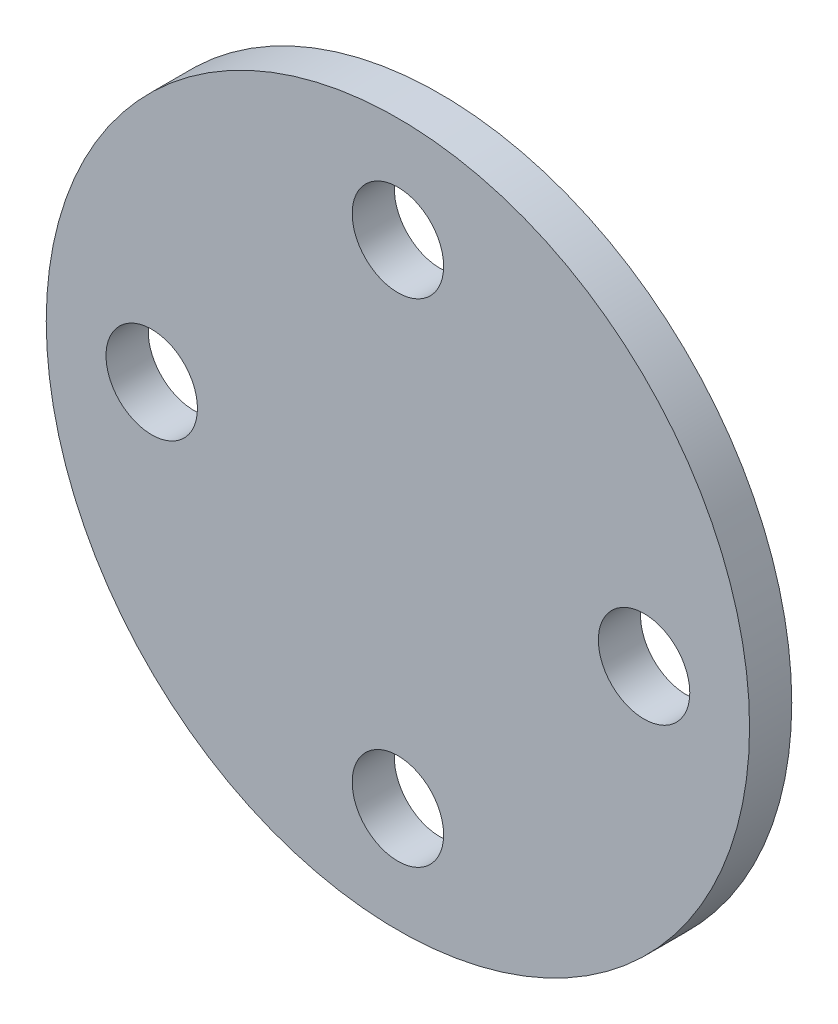
ISO-10303-21;
HEADER;
FILE_DESCRIPTION(('STEP AP214'),'2;1');
FILE_NAME('part.step','',(''),(''),'','','');
FILE_SCHEMA(('AUTOMOTIVE_DESIGN { 1 0 10303 214 1 1 1 1 }'));
ENDSEC;
DATA;
#1=APPLICATION_CONTEXT('core data for automotive mechanical design processes');
#2=APPLICATION_PROTOCOL_DEFINITION('international standard','automotive_design',2000,#1);
#3=PRODUCT_CONTEXT('',#1,'mechanical');
#4=PRODUCT('Part','Part','',(#3));
#5=PRODUCT_RELATED_PRODUCT_CATEGORY('part','',(#4));
#6=PRODUCT_DEFINITION_FORMATION('','',#4);
#7=PRODUCT_DEFINITION_CONTEXT('part definition',#1,'design');
#8=PRODUCT_DEFINITION('design','',#6,#7);
#9=PRODUCT_DEFINITION_SHAPE('','',#8);
#10=(LENGTH_UNIT() NAMED_UNIT(*) SI_UNIT(.MILLI.,.METRE.));
#11=(NAMED_UNIT(*) PLANE_ANGLE_UNIT() SI_UNIT($,.RADIAN.));
#12=(NAMED_UNIT(*) SI_UNIT($,.STERADIAN.) SOLID_ANGLE_UNIT());
#13=UNCERTAINTY_MEASURE_WITH_UNIT(LENGTH_MEASURE(1.E-05),#10,'distance_accuracy_value','');
#14=(GEOMETRIC_REPRESENTATION_CONTEXT(3) GLOBAL_UNCERTAINTY_ASSIGNED_CONTEXT((#13)) GLOBAL_UNIT_ASSIGNED_CONTEXT((#10,
#11,#12)) REPRESENTATION_CONTEXT('',''));
#15=CARTESIAN_POINT('',(0.,0.,0.));
#16=DIRECTION('',(0.,0.,1.));
#17=DIRECTION('',(1.,0.,0.));
#18=AXIS2_PLACEMENT_3D('',#15,#16,#17);
#19=CARTESIAN_POINT('',(0.,0.,3.));
#20=DIRECTION('',(0.,0.,1.));
#21=DIRECTION('',(1.,0.,0.));
#22=AXIS2_PLACEMENT_3D('',#19,#20,#21);
#23=PLANE('',#22);
#24=CARTESIAN_POINT('',(0.,-17.5,3.));
#25=DIRECTION('',(0.,0.,1.));
#26=DIRECTION('',(1.,0.,0.));
#27=AXIS2_PLACEMENT_3D('',#24,#25,#26);
#28=CIRCLE('',#27,3.25000000000012);
#29=CARTESIAN_POINT('',(3.25000000000012,-17.5,3.));
#30=VERTEX_POINT('',#29);
#31=EDGE_CURVE('E57',#30,#30,#28,.T.);
#32=ORIENTED_EDGE('',*,*,#31,.F.);
#33=EDGE_LOOP('',(#32));
#34=FACE_BOUND('',#33,.T.);
#35=CARTESIAN_POINT('',(0.,17.5,3.));
#36=DIRECTION('',(0.,0.,1.));
#37=DIRECTION('',(1.,0.,0.));
#38=AXIS2_PLACEMENT_3D('',#35,#36,#37);
#39=CIRCLE('',#38,3.25);
#40=CARTESIAN_POINT('',(3.25,17.5,3.));
#41=VERTEX_POINT('',#40);
#42=EDGE_CURVE('E46',#41,#41,#39,.T.);
#43=ORIENTED_EDGE('',*,*,#42,.F.);
#44=EDGE_LOOP('',(#43));
#45=FACE_BOUND('',#44,.T.);
#46=CARTESIAN_POINT('',(0.,0.,3.));
#47=DIRECTION('',(0.,0.,1.));
#48=DIRECTION('',(1.,0.,0.));
#49=AXIS2_PLACEMENT_3D('',#46,#47,#48);
#50=CIRCLE('',#49,25.);
#51=CARTESIAN_POINT('',(25.,0.,3.));
#52=VERTEX_POINT('',#51);
#53=EDGE_CURVE('E10',#52,#52,#50,.T.);
#54=ORIENTED_EDGE('',*,*,#53,.T.);
#55=EDGE_LOOP('',(#54));
#56=FACE_BOUND('',#55,.T.);
#57=CARTESIAN_POINT('',(17.5,0.,3.));
#58=DIRECTION('',(0.,0.,1.));
#59=DIRECTION('',(1.,0.,0.));
#60=AXIS2_PLACEMENT_3D('',#57,#58,#59);
#61=CIRCLE('',#60,3.25000000000006);
#62=CARTESIAN_POINT('',(20.7500000000001,0.,3.));
#63=VERTEX_POINT('',#62);
#64=EDGE_CURVE('E51',#63,#63,#61,.T.);
#65=ORIENTED_EDGE('',*,*,#64,.F.);
#66=EDGE_LOOP('',(#65));
#67=FACE_BOUND('',#66,.T.);
#68=CARTESIAN_POINT('',(-17.5,0.,3.));
#69=DIRECTION('',(0.,0.,1.));
#70=DIRECTION('',(1.,0.,0.));
#71=AXIS2_PLACEMENT_3D('',#68,#69,#70);
#72=CIRCLE('',#71,3.25000000000018);
#73=CARTESIAN_POINT('',(-14.2499999999998,0.,3.));
#74=VERTEX_POINT('',#73);
#75=EDGE_CURVE('E63',#74,#74,#72,.T.);
#76=ORIENTED_EDGE('',*,*,#75,.F.);
#77=EDGE_LOOP('',(#76));
#78=FACE_BOUND('',#77,.T.);
#79=ADVANCED_FACE('F35',(#34,#45,#56,#67,#78),#23,.T.);
#80=CARTESIAN_POINT('',(0.,0.,0.));
#81=DIRECTION('',(0.,0.,1.));
#82=DIRECTION('',(1.,0.,0.));
#83=AXIS2_PLACEMENT_3D('',#80,#81,#82);
#84=PLANE('',#83);
#85=CARTESIAN_POINT('',(0.,0.,0.));
#86=DIRECTION('',(0.,0.,1.));
#87=DIRECTION('',(1.,0.,0.));
#88=AXIS2_PLACEMENT_3D('',#85,#86,#87);
#89=CIRCLE('',#88,25.);
#90=CARTESIAN_POINT('',(25.,0.,0.));
#91=VERTEX_POINT('',#90);
#92=EDGE_CURVE('E39',#91,#91,#89,.T.);
#93=ORIENTED_EDGE('',*,*,#92,.F.);
#94=EDGE_LOOP('',(#93));
#95=FACE_BOUND('',#94,.T.);
#96=CARTESIAN_POINT('',(0.,17.5,0.));
#97=DIRECTION('',(0.,0.,1.));
#98=DIRECTION('',(1.,0.,0.));
#99=AXIS2_PLACEMENT_3D('',#96,#97,#98);
#100=CIRCLE('',#99,3.25);
#101=CARTESIAN_POINT('',(3.25,17.5,0.));
#102=VERTEX_POINT('',#101);
#103=EDGE_CURVE('E48',#102,#102,#100,.T.);
#104=ORIENTED_EDGE('',*,*,#103,.T.);
#105=EDGE_LOOP('',(#104));
#106=FACE_BOUND('',#105,.T.);
#107=CARTESIAN_POINT('',(17.5,0.,0.));
#108=DIRECTION('',(0.,0.,1.));
#109=DIRECTION('',(1.,0.,0.));
#110=AXIS2_PLACEMENT_3D('',#107,#108,#109);
#111=CIRCLE('',#110,3.25000000000006);
#112=CARTESIAN_POINT('',(20.7500000000001,0.,0.));
#113=VERTEX_POINT('',#112);
#114=EDGE_CURVE('E54',#113,#113,#111,.T.);
#115=ORIENTED_EDGE('',*,*,#114,.T.);
#116=EDGE_LOOP('',(#115));
#117=FACE_BOUND('',#116,.T.);
#118=CARTESIAN_POINT('',(0.,-17.5,0.));
#119=DIRECTION('',(0.,0.,1.));
#120=DIRECTION('',(1.,0.,0.));
#121=AXIS2_PLACEMENT_3D('',#118,#119,#120);
#122=CIRCLE('',#121,3.25000000000012);
#123=CARTESIAN_POINT('',(3.25000000000012,-17.5,0.));
#124=VERTEX_POINT('',#123);
#125=EDGE_CURVE('E60',#124,#124,#122,.T.);
#126=ORIENTED_EDGE('',*,*,#125,.T.);
#127=EDGE_LOOP('',(#126));
#128=FACE_BOUND('',#127,.T.);
#129=CARTESIAN_POINT('',(-17.5,0.,0.));
#130=DIRECTION('',(0.,0.,1.));
#131=DIRECTION('',(1.,0.,0.));
#132=AXIS2_PLACEMENT_3D('',#129,#130,#131);
#133=CIRCLE('',#132,3.25000000000018);
#134=CARTESIAN_POINT('',(-14.2499999999998,0.,0.));
#135=VERTEX_POINT('',#134);
#136=EDGE_CURVE('E66',#135,#135,#133,.T.);
#137=ORIENTED_EDGE('',*,*,#136,.T.);
#138=EDGE_LOOP('',(#137));
#139=FACE_BOUND('',#138,.T.);
#140=ADVANCED_FACE('F76',(#95,#106,#117,#128,#139),#84,.F.);
#141=CARTESIAN_POINT('',(0.,0.,3.));
#142=DIRECTION('',(0.,0.,-1.));
#143=DIRECTION('',(-1.,0.,0.));
#144=AXIS2_PLACEMENT_3D('',#141,#142,#143);
#145=CYLINDRICAL_SURFACE('',#144,25.);
#146=ORIENTED_EDGE('',*,*,#53,.F.);
#147=EDGE_LOOP('',(#146));
#148=FACE_BOUND('',#147,.T.);
#149=ORIENTED_EDGE('',*,*,#92,.T.);
#150=EDGE_LOOP('',(#149));
#151=FACE_BOUND('',#150,.T.);
#152=ADVANCED_FACE('F37',(#148,#151),#145,.T.);
#153=CARTESIAN_POINT('',(0.,17.5,3.));
#154=DIRECTION('',(0.,0.,-1.));
#155=DIRECTION('',(-1.,0.,0.));
#156=AXIS2_PLACEMENT_3D('',#153,#154,#155);
#157=CYLINDRICAL_SURFACE('',#156,3.25);
#158=ORIENTED_EDGE('',*,*,#42,.T.);
#159=EDGE_LOOP('',(#158));
#160=FACE_BOUND('',#159,.T.);
#161=ORIENTED_EDGE('',*,*,#103,.F.);
#162=EDGE_LOOP('',(#161));
#163=FACE_BOUND('',#162,.T.);
#164=ADVANCED_FACE('F86',(#160,#163),#157,.F.);
#165=CARTESIAN_POINT('',(17.5,0.,3.));
#166=DIRECTION('',(0.,0.,-1.));
#167=DIRECTION('',(-1.,0.,0.));
#168=AXIS2_PLACEMENT_3D('',#165,#166,#167);
#169=CYLINDRICAL_SURFACE('',#168,3.25000000000006);
#170=ORIENTED_EDGE('',*,*,#64,.T.);
#171=EDGE_LOOP('',(#170));
#172=FACE_BOUND('',#171,.T.);
#173=ORIENTED_EDGE('',*,*,#114,.F.);
#174=EDGE_LOOP('',(#173));
#175=FACE_BOUND('',#174,.T.);
#176=ADVANCED_FACE('F89',(#172,#175),#169,.F.);
#177=CARTESIAN_POINT('',(0.,-17.5,3.));
#178=DIRECTION('',(0.,0.,-1.));
#179=DIRECTION('',(-1.,0.,0.));
#180=AXIS2_PLACEMENT_3D('',#177,#178,#179);
#181=CYLINDRICAL_SURFACE('',#180,3.25000000000012);
#182=ORIENTED_EDGE('',*,*,#31,.T.);
#183=EDGE_LOOP('',(#182));
#184=FACE_BOUND('',#183,.T.);
#185=ORIENTED_EDGE('',*,*,#125,.F.);
#186=EDGE_LOOP('',(#185));
#187=FACE_BOUND('',#186,.T.);
#188=ADVANCED_FACE('F93',(#184,#187),#181,.F.);
#189=CARTESIAN_POINT('',(-17.5,0.,3.));
#190=DIRECTION('',(0.,0.,-1.));
#191=DIRECTION('',(-1.,0.,0.));
#192=AXIS2_PLACEMENT_3D('',#189,#190,#191);
#193=CYLINDRICAL_SURFACE('',#192,3.25000000000018);
#194=ORIENTED_EDGE('',*,*,#75,.T.);
#195=EDGE_LOOP('',(#194));
#196=FACE_BOUND('',#195,.T.);
#197=ORIENTED_EDGE('',*,*,#136,.F.);
#198=EDGE_LOOP('',(#197));
#199=FACE_BOUND('',#198,.T.);
#200=ADVANCED_FACE('F72',(#196,#199),#193,.F.);
#201=CLOSED_SHELL('',(#79,#140,#152,#164,#176,#188,#200));
#202=MANIFOLD_SOLID_BREP('B2',#201);
#203=ADVANCED_BREP_SHAPE_REPRESENTATION('',(#18,#202),#14);
#204=SHAPE_DEFINITION_REPRESENTATION(#9,#203);
ENDSEC;
END-ISO-10303-21;
